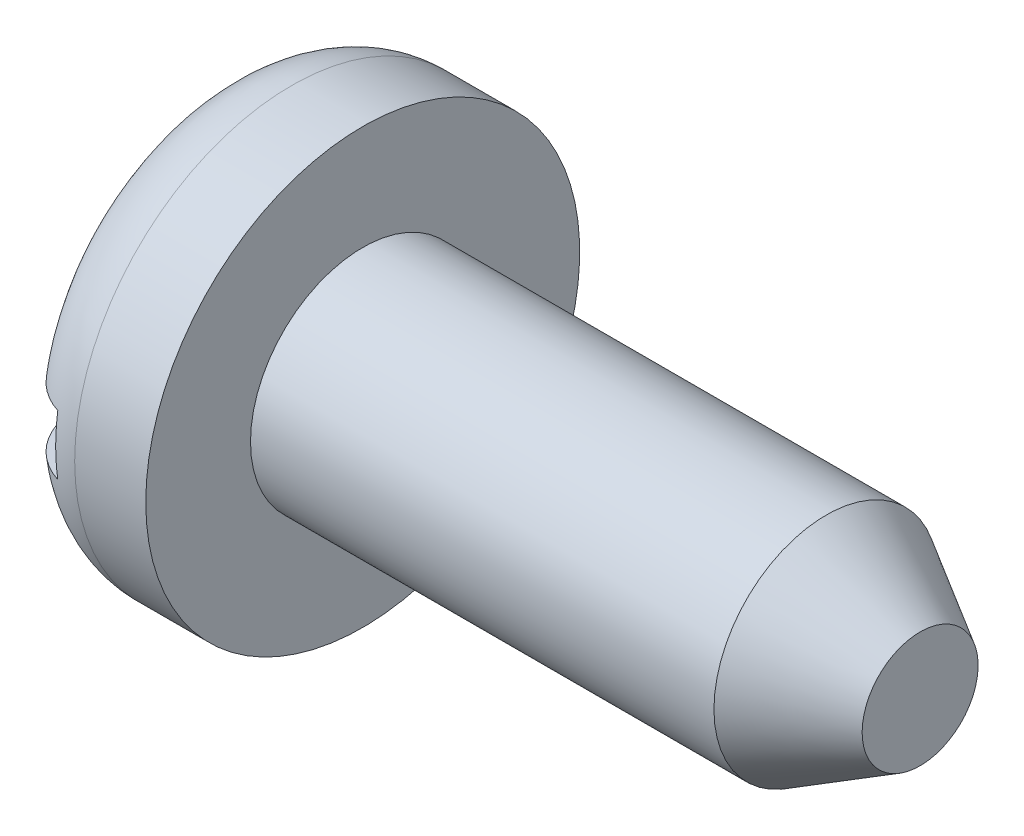
ISO-10303-21;
HEADER;
FILE_DESCRIPTION(('STEP AP214'),'2;1');
FILE_NAME('part.step','',(''),(''),'','','');
FILE_SCHEMA(('AUTOMOTIVE_DESIGN { 1 0 10303 214 1 1 1 1 }'));
ENDSEC;
DATA;
#1=APPLICATION_CONTEXT('core data for automotive mechanical design processes');
#2=APPLICATION_PROTOCOL_DEFINITION('international standard','automotive_design',2000,#1);
#3=PRODUCT_CONTEXT('',#1,'mechanical');
#4=PRODUCT('Part','Part','',(#3));
#5=PRODUCT_RELATED_PRODUCT_CATEGORY('part','',(#4));
#6=PRODUCT_DEFINITION_FORMATION('','',#4);
#7=PRODUCT_DEFINITION_CONTEXT('part definition',#1,'design');
#8=PRODUCT_DEFINITION('design','',#6,#7);
#9=PRODUCT_DEFINITION_SHAPE('','',#8);
#10=(LENGTH_UNIT() NAMED_UNIT(*) SI_UNIT(.MILLI.,.METRE.));
#11=(NAMED_UNIT(*) PLANE_ANGLE_UNIT() SI_UNIT($,.RADIAN.));
#12=(NAMED_UNIT(*) SI_UNIT($,.STERADIAN.) SOLID_ANGLE_UNIT());
#13=UNCERTAINTY_MEASURE_WITH_UNIT(LENGTH_MEASURE(1.E-05),#10,'distance_accuracy_value','');
#14=(GEOMETRIC_REPRESENTATION_CONTEXT(3) GLOBAL_UNCERTAINTY_ASSIGNED_CONTEXT((#13)) GLOBAL_UNIT_ASSIGNED_CONTEXT((#10,
#11,#12)) REPRESENTATION_CONTEXT('',''));
#15=CARTESIAN_POINT('',(0.,0.,0.));
#16=DIRECTION('',(0.,0.,1.));
#17=DIRECTION('',(1.,0.,0.));
#18=AXIS2_PLACEMENT_3D('',#15,#16,#17);
#19=CARTESIAN_POINT('',(0.,0.,0.));
#20=DIRECTION('',(-1.,0.,0.));
#21=DIRECTION('',(0.,0.,1.));
#22=AXIS2_PLACEMENT_3D('',#19,#20,#21);
#23=CYLINDRICAL_SURFACE('',#22,0.762);
#24=CARTESIAN_POINT('',(0.9906,0.,0.));
#25=DIRECTION('',(-1.,0.,0.));
#26=DIRECTION('',(0.,0.,1.));
#27=AXIS2_PLACEMENT_3D('',#24,#25,#26);
#28=CIRCLE('',#27,0.762);
#29=CARTESIAN_POINT('',(0.9906,0.,0.762));
#30=VERTEX_POINT('',#29);
#31=EDGE_CURVE('E158',#30,#30,#28,.T.);
#32=ORIENTED_EDGE('',*,*,#31,.F.);
#33=EDGE_LOOP('',(#32));
#34=FACE_BOUND('',#33,.T.);
#35=CARTESIAN_POINT('',(4.13728568757237,0.,0.));
#36=DIRECTION('',(-1.,0.,0.));
#37=DIRECTION('',(0.,0.,1.));
#38=AXIS2_PLACEMENT_3D('',#35,#36,#37);
#39=CIRCLE('',#38,0.762);
#40=CARTESIAN_POINT('',(4.13728568757237,0.,0.762));
#41=VERTEX_POINT('',#40);
#42=EDGE_CURVE('E267',#41,#41,#39,.T.);
#43=ORIENTED_EDGE('',*,*,#42,.T.);
#44=EDGE_LOOP('',(#43));
#45=FACE_BOUND('',#44,.T.);
#46=ADVANCED_FACE('F68',(#34,#45),#23,.T.);
#47=CARTESIAN_POINT('',(0.,0.,0.));
#48=DIRECTION('',(1.,0.,0.));
#49=DIRECTION('',(0.,0.,-1.));
#50=AXIS2_PLACEMENT_3D('',#47,#48,#49);
#51=PLANE('',#50);
#52=CARTESIAN_POINT('',(0.,0.,0.));
#53=DIRECTION('',(-1.,0.,0.));
#54=DIRECTION('',(0.,0.,1.));
#55=AXIS2_PLACEMENT_3D('',#52,#53,#54);
#56=CIRCLE('',#55,0.965199999999997);
#57=CARTESIAN_POINT('',(0.,0.2032,0.943568121546562));
#58=VERTEX_POINT('',#57);
#59=CARTESIAN_POINT('',(0.,0.2032,-0.943568121547147));
#60=VERTEX_POINT('',#59);
#61=EDGE_CURVE('E152',#58,#60,#56,.T.);
#62=ORIENTED_EDGE('',*,*,#61,.T.);
#63=DIRECTION('',(0.,0.,1.));
#64=VECTOR('',#63,1.);
#65=CARTESIAN_POINT('',(0.,0.2032,-1.4732));
#66=LINE('',#65,#64);
#67=EDGE_CURVE('E156',#60,#58,#66,.T.);
#68=ORIENTED_EDGE('',*,*,#67,.T.);
#69=EDGE_LOOP('',(#62,#68));
#70=FACE_BOUND('',#69,.T.);
#71=ADVANCED_FACE('F174',(#70),#51,.F.);
#72=CARTESIAN_POINT('',(0.,-0.2032,-0.943568121562039));
#73=VERTEX_POINT('',#72);
#74=CARTESIAN_POINT('',(0.,-0.2032,0.943568121547137));
#75=VERTEX_POINT('',#74);
#76=EDGE_CURVE('E131',#73,#75,#56,.T.);
#77=ORIENTED_EDGE('',*,*,#76,.T.);
#78=DIRECTION('',(0.,0.,1.));
#79=VECTOR('',#78,1.);
#80=CARTESIAN_POINT('',(0.,-0.2032,-1.4732));
#81=LINE('',#80,#79);
#82=EDGE_CURVE('E86',#73,#75,#81,.T.);
#83=ORIENTED_EDGE('',*,*,#82,.F.);
#84=EDGE_LOOP('',(#77,#83));
#85=FACE_BOUND('',#84,.T.);
#86=ADVANCED_FACE('F70',(#85),#51,.F.);
#87=CARTESIAN_POINT('',(0.508,0.,0.));
#88=DIRECTION('',(-1.,0.,0.));
#89=DIRECTION('',(0.,0.,1.));
#90=AXIS2_PLACEMENT_3D('',#87,#88,#89);
#91=TOROIDAL_SURFACE('',#90,0.9652,0.508);
#92=CARTESIAN_POINT('',(0.3556,0.,0.));
#93=DIRECTION('',(1.,0.,0.));
#94=DIRECTION('',(0.,0.,-1.));
#95=AXIS2_PLACEMENT_3D('',#92,#93,#94);
#96=CIRCLE('',#95,1.44980111431981);
#97=CARTESIAN_POINT('',(0.3556,-0.2032,-1.43549051932883));
#98=VERTEX_POINT('',#97);
#99=CARTESIAN_POINT('',(0.3556,0.2032,-1.43549051932883));
#100=VERTEX_POINT('',#99);
#101=EDGE_CURVE('E79',#98,#100,#96,.T.);
#102=ORIENTED_EDGE('',*,*,#101,.T.);
#103=CARTESIAN_POINT('',(0.215329781023816,0.2032,-1.36538301604439));
#104=CARTESIAN_POINT('',(0.191944983256552,0.2032,-1.34871688538471));
#105=CARTESIAN_POINT('',(0.169960976103504,0.2032,-1.33004517340369));
#106=CARTESIAN_POINT('',(0.129435108720529,0.2032,-1.28924702351786));
#107=CARTESIAN_POINT('',(0.110897971057547,0.2032,-1.26711592115187));
#108=CARTESIAN_POINT('',(0.0778104746302251,0.2032,-1.22008418730413));
#109=CARTESIAN_POINT('',(0.0632559800643974,0.2032,-1.19518646691671));
#110=CARTESIAN_POINT('',(0.0384902434353467,0.2032,-1.14332891973057));
#111=CARTESIAN_POINT('',(0.0282778660080875,0.2032,-1.11636963416183));
#112=CARTESIAN_POINT('',(0.0123455852323958,0.2032,-1.06084918044724));
#113=CARTESIAN_POINT('',(0.00667399543653688,0.2032,-1.03227416112994));
#114=CARTESIAN_POINT('',(0.000107317688346896,0.2032,-0.974580691497605));
#115=CARTESIAN_POINT('',(-0.000787139628520222,0.2032,-0.945462169943261));
#116=CARTESIAN_POINT('',(0.00219793428343748,0.2032,-0.886884383126212));
#117=CARTESIAN_POINT('',(0.00617386350756716,0.2032,-0.857430046804635));
#118=CARTESIAN_POINT('',(0.0188922095928852,0.2032,-0.799570485455021));
#119=CARTESIAN_POINT('',(0.027635171565733,0.2032,-0.771165380803658));
#120=CARTESIAN_POINT('',(0.0498738289848896,0.2032,-0.715468093785361));
#121=CARTESIAN_POINT('',(0.063481095366547,0.2032,-0.688220446760224));
#122=CARTESIAN_POINT('',(0.095000354806635,0.2032,-0.636333965316028));
#123=CARTESIAN_POINT('',(0.112913375454603,0.2032,-0.61169575567725));
#124=CARTESIAN_POINT('',(0.152912188620876,0.2032,-0.56532174947494));
#125=CARTESIAN_POINT('',(0.175064463510091,0.2032,-0.543643174015656));
#126=CARTESIAN_POINT('',(0.222778207104463,0.2032,-0.504409781797503));
#127=CARTESIAN_POINT('',(0.248340011315482,0.2032,-0.486855371336383));
#128=CARTESIAN_POINT('',(0.301530089174878,0.2032,-0.457008273910215));
#129=CARTESIAN_POINT('',(0.329089146032147,0.2032,-0.444592957026038));
#130=CARTESIAN_POINT('',(0.386028984100668,0.2032,-0.425113677820577));
#131=CARTESIAN_POINT('',(0.415407624704707,0.2032,-0.418043551949753));
#132=CARTESIAN_POINT('',(0.472201440289541,0.2032,-0.41016003303868));
#133=CARTESIAN_POINT('',(0.499544523136924,0.2032,-0.408825069877718));
#134=CARTESIAN_POINT('',(0.554024274863372,0.2032,-0.411075893852427));
#135=CARTESIAN_POINT('',(0.581160976992131,0.2032,-0.41466087070081));
#136=CARTESIAN_POINT('',(0.632878799636407,0.2032,-0.426162382545665));
#137=CARTESIAN_POINT('',(0.657517767441619,0.2032,-0.433823526645508));
#138=CARTESIAN_POINT('',(0.70529059677053,0.2032,-0.452906536237889));
#139=CARTESIAN_POINT('',(0.728423980012061,0.2032,-0.464329589867681));
#140=CARTESIAN_POINT('',(0.774242601599961,0.2032,-0.491392156820385));
#141=CARTESIAN_POINT('',(0.796788648105484,0.2032,-0.507266858440053));
#142=CARTESIAN_POINT('',(0.839182680703283,0.2032,-0.54228103413312));
#143=CARTESIAN_POINT('',(0.859029767712484,0.2032,-0.561421591371043));
#144=CARTESIAN_POINT('',(0.897266847990072,0.2032,-0.604308205893024));
#145=CARTESIAN_POINT('',(0.915367308448543,0.2032,-0.628313168377821));
#146=CARTESIAN_POINT('',(0.947426016921696,0.2032,-0.678948835654952));
#147=CARTESIAN_POINT('',(0.961383432464618,0.2032,-0.705580066719417));
#148=CARTESIAN_POINT('',(0.98511078522371,0.2032,-0.761607938309915));
#149=CARTESIAN_POINT('',(0.994741238623541,0.2032,-0.791063872562686));
#150=CARTESIAN_POINT('',(1.00884220772929,0.2032,-0.851187933607647));
#151=CARTESIAN_POINT('',(1.01331295274497,0.2032,-0.881856006466845));
#152=CARTESIAN_POINT('',(1.01686801593526,0.2032,-0.943068837569881));
#153=CARTESIAN_POINT('',(1.01602778814561,0.2032,-0.973609181679535));
#154=CARTESIAN_POINT('',(1.00909458546175,0.2032,-1.03408891386127));
#155=CARTESIAN_POINT('',(1.00300227947049,0.2032,-1.06402837796438));
#156=CARTESIAN_POINT('',(0.985908571631898,0.2032,-1.12165762872575));
#157=CARTESIAN_POINT('',(0.97503362174308,0.2032,-1.14938493314587));
#158=CARTESIAN_POINT('',(0.948685861116407,0.2032,-1.20256218996186));
#159=CARTESIAN_POINT('',(0.933213586811747,0.2032,-1.22801240760628));
#160=CARTESIAN_POINT('',(0.89846723181936,0.2032,-1.27535454080846));
#161=CARTESIAN_POINT('',(0.879279077836541,0.2032,-1.29730954549528));
#162=CARTESIAN_POINT('',(0.837441643381917,0.2032,-1.3376286301575));
#163=CARTESIAN_POINT('',(0.814792643127839,0.2032,-1.35599300058512));
#164=CARTESIAN_POINT('',(0.767025978772371,0.2032,-1.38834234645129));
#165=CARTESIAN_POINT('',(0.741947758587901,0.2032,-1.40238558541945));
#166=CARTESIAN_POINT('',(0.689776102168764,0.2032,-1.42602105185323));
#167=CARTESIAN_POINT('',(0.662682854759224,0.2032,-1.43561369576909));
#168=CARTESIAN_POINT('',(0.607495786820999,0.2032,-1.45000048844254));
#169=CARTESIAN_POINT('',(0.579412325194333,0.2032,-1.45483440265148));
#170=CARTESIAN_POINT('',(0.522824376888471,0.2032,-1.4597015516763));
#171=CARTESIAN_POINT('',(0.494319790725371,0.2032,-1.45973363339659));
#172=CARTESIAN_POINT('',(0.437799890024802,0.2032,-1.45500220755093));
#173=CARTESIAN_POINT('',(0.409783377574426,0.2032,-1.45025288589255));
#174=CARTESIAN_POINT('',(0.354970748329165,0.2032,-1.4361218473685));
#175=CARTESIAN_POINT('',(0.328173106838488,0.2032,-1.42674610209147));
#176=CARTESIAN_POINT('',(0.287078819494603,0.2032,-1.40837034141523));
#177=CARTESIAN_POINT('',(0.272138306490352,0.2032,-1.40077440713547));
#178=CARTESIAN_POINT('',(0.24308296993529,0.2032,-1.38414070953568));
#179=CARTESIAN_POINT('',(0.228968143293964,0.2032,-1.37510295161281));
#180=CARTESIAN_POINT('',(0.215329781023816,0.2032,-1.36538301604439));
#181=B_SPLINE_CURVE_WITH_KNOTS('',3,(#103,#104,#105,#106,#107,#108,#109,#110,#111,#112,#113,
#114,#115,#116,#117,#118,#119,#120,#121,#122,#123,#124,#125,#126,#127,#128,#129,#130,#131,#132,
#133,#134,#135,#136,#137,#138,#139,#140,#141,#142,#143,#144,#145,#146,#147,#148,#149,#150,#151,
#152,#153,#154,#155,#156,#157,#158,#159,#160,#161,#162,#163,#164,#165,#166,#167,#168,#169,#170,
#171,#172,#173,#174,#175,#176,#177,#178,#179,#180),.UNSPECIFIED.,.T.,.F.,(4,2,2,2,2,2,2,2,2,2,2,
2,2,2,2,2,2,2,2,2,2,2,2,2,2,2,2,2,2,2,2,2,2,2,2,2,2,2,4),(0.,0.0860858664197994,
0.172288824011097,0.258401920897595,0.344492487316557,0.431487309397069,0.518493615493238,
0.607250185600888,0.696016907178807,0.786966152111568,0.877937124119505,0.970473054750091,
1.0630180978651,1.15320598197585,1.24328971098599,1.3249802732473,1.40665738313295,
1.48373329633542,1.56083357608073,1.64321408029617,1.72562196040306,1.81540769437433,
1.90521145701111,1.99773250963021,2.09024945023436,2.18145496769302,2.27264887096263,
2.36156438070333,2.45046951951772,2.53752232781106,2.62456809134573,2.71038278763392,
2.79618945246545,2.88127284414335,2.96637666742217,3.05122873877004,3.13597157208161,
3.18617831917688,3.23638487833799),.UNSPECIFIED.);
#182=EDGE_CURVE('E42',#100,#60,#181,.T.);
#183=ORIENTED_EDGE('',*,*,#182,.T.);
#184=ORIENTED_EDGE('',*,*,#61,.F.);
#185=CARTESIAN_POINT('',(0.329869522395055,0.2032,0.445281621598736));
#186=CARTESIAN_POINT('',(0.301388127727567,0.2032,0.457004986077337));
#187=CARTESIAN_POINT('',(0.273974546779743,0.2032,0.471423119659136));
#188=CARTESIAN_POINT('',(0.22208540367213,0.2032,0.504890847364411));
#189=CARTESIAN_POINT('',(0.197617795729669,0.2032,0.523952578082407));
#190=CARTESIAN_POINT('',(0.153596858359432,0.2032,0.564745375334223));
#191=CARTESIAN_POINT('',(0.133841470806211,0.2032,0.586259042938739));
#192=CARTESIAN_POINT('',(0.0979993542396418,0.2032,0.632122682831279));
#193=CARTESIAN_POINT('',(0.0819099449489213,0.2032,0.656470563158186));
#194=CARTESIAN_POINT('',(0.0529638986825167,0.2032,0.708889100740837));
#195=CARTESIAN_POINT('',(0.0403491262178022,0.2032,0.737093814829098));
#196=CARTESIAN_POINT('',(0.0200538005795712,0.2032,0.795235287370737));
#197=CARTESIAN_POINT('',(0.0123744172169766,0.2032,0.825172454627384));
#198=CARTESIAN_POINT('',(0.00226364021682771,0.2032,0.885780221619265));
#199=CARTESIAN_POINT('',(-0.00019208357882027,0.2032,0.916446745378072));
#200=CARTESIAN_POINT('',(0.000215499636248874,0.2032,0.977744949006937));
#201=CARTESIAN_POINT('',(0.00307803488829328,0.2032,1.00837663328728));
#202=CARTESIAN_POINT('',(0.0139659486859273,0.2032,1.06794438752535));
#203=CARTESIAN_POINT('',(0.0218650304823141,0.2032,1.09690353921922));
#204=CARTESIAN_POINT('',(0.0425262368132979,0.2032,1.15303253778322));
#205=CARTESIAN_POINT('',(0.0552877435612657,0.2032,1.18020261144732));
#206=CARTESIAN_POINT('',(0.084988601790195,0.2032,1.23132857253371));
#207=CARTESIAN_POINT('',(0.101826393931794,0.2032,1.25534348243389));
#208=CARTESIAN_POINT('',(0.139356343475907,0.2032,1.30014514598456));
#209=CARTESIAN_POINT('',(0.160048146491578,0.2032,1.32093219612359));
#210=CARTESIAN_POINT('',(0.204331568152334,0.2032,1.35833837902795));
#211=CARTESIAN_POINT('',(0.227870778380537,0.2032,1.37501957772596));
#212=CARTESIAN_POINT('',(0.277438317149333,0.2032,1.4041461886003));
#213=CARTESIAN_POINT('',(0.303466492316324,0.2032,1.41659186156064));
#214=CARTESIAN_POINT('',(0.356990995047148,0.2032,1.43677120300235));
#215=CARTESIAN_POINT('',(0.384470015728362,0.2032,1.44455079753911));
#216=CARTESIAN_POINT('',(0.440346707045098,0.2032,1.45536093850396));
#217=CARTESIAN_POINT('',(0.468744347416753,0.2032,1.4583916412217));
#218=CARTESIAN_POINT('',(0.52550374831587,0.2032,1.45961107131118));
#219=CARTESIAN_POINT('',(0.553865004421325,0.2032,1.45782341992553));
#220=CARTESIAN_POINT('',(0.609883819147741,0.2032,1.44950941198501));
#221=CARTESIAN_POINT('',(0.637541385690404,0.2032,1.4429831087994));
#222=CARTESIAN_POINT('',(0.691357493366147,0.2032,1.42538788074117));
#223=CARTESIAN_POINT('',(0.717516691820668,0.2032,1.41432096546201));
#224=CARTESIAN_POINT('',(0.767615418543723,0.2032,1.38796878326541));
#225=CARTESIAN_POINT('',(0.79155492684436,0.2032,1.3726834784051));
#226=CARTESIAN_POINT('',(0.836640025706202,0.2032,1.33827130309483));
#227=CARTESIAN_POINT('',(0.857774337524385,0.2032,1.3191296601217));
#228=CARTESIAN_POINT('',(0.896562320947285,0.2032,1.277597196705));
#229=CARTESIAN_POINT('',(0.914215887276242,0.2032,1.25520627802207));
#230=CARTESIAN_POINT('',(0.945713471397315,0.2032,1.20760814494182));
#231=CARTESIAN_POINT('',(0.959523023498841,0.2032,1.1823781315459));
#232=CARTESIAN_POINT('',(0.982777077796622,0.2032,1.12998246814469));
#233=CARTESIAN_POINT('',(0.99222134397096,0.2032,1.10281671356954));
#234=CARTESIAN_POINT('',(1.00663194773297,0.2032,1.04690763023515));
#235=CARTESIAN_POINT('',(1.0115321497481,0.2032,1.01814726867179));
#236=CARTESIAN_POINT('',(1.01653829298727,0.2032,0.960213775553606));
#237=CARTESIAN_POINT('',(1.0166437849315,0.2032,0.931040605573512));
#238=CARTESIAN_POINT('',(1.0120686063743,0.2032,0.872467788856669));
#239=CARTESIAN_POINT('',(1.00728924754504,0.2032,0.84307586652726));
#240=CARTESIAN_POINT('',(0.992985683796285,0.2032,0.785471434229729));
#241=CARTESIAN_POINT('',(0.98346091997659,0.2032,0.757259063610166));
#242=CARTESIAN_POINT('',(0.95967909954554,0.2032,0.702076513184541));
#243=CARTESIAN_POINT('',(0.945311192362788,0.2032,0.67515408783268));
#244=CARTESIAN_POINT('',(0.912326806716271,0.2032,0.624042948669372));
#245=CARTESIAN_POINT('',(0.89370918179318,0.2032,0.599854975177044));
#246=CARTESIAN_POINT('',(0.852394840830588,0.2032,0.554555145650083));
#247=CARTESIAN_POINT('',(0.829639553822971,0.2032,0.533496581812988));
#248=CARTESIAN_POINT('',(0.78081955379486,0.2032,0.495627545914252));
#249=CARTESIAN_POINT('',(0.754755018537147,0.2032,0.478816845815188));
#250=CARTESIAN_POINT('',(0.700850214783034,0.2032,0.450647431345639));
#251=CARTESIAN_POINT('',(0.673090873798326,0.2032,0.43913478213141));
#252=CARTESIAN_POINT('',(0.615907562786327,0.2032,0.421501203163709));
#253=CARTESIAN_POINT('',(0.586484993162199,0.2032,0.415375807352146));
#254=CARTESIAN_POINT('',(0.529860327127162,0.2032,0.409286758160104));
#255=CARTESIAN_POINT('',(0.502714546854052,0.2032,0.408790479263192));
#256=CARTESIAN_POINT('',(0.448794382738234,0.2032,0.412621451438393));
#257=CARTESIAN_POINT('',(0.422019484985736,0.2032,0.416941169030422));
#258=CARTESIAN_POINT('',(0.38460048097378,0.2032,0.426332473149217));
#259=CARTESIAN_POINT('',(0.373465559557966,0.2032,0.429570215711043));
#260=CARTESIAN_POINT('',(0.351459877271103,0.2032,0.436838698586312));
#261=CARTESIAN_POINT('',(0.340589069524359,0.2032,0.440869297008964));
#262=CARTESIAN_POINT('',(0.329869522395055,0.2032,0.445281621598736));
#263=B_SPLINE_CURVE_WITH_KNOTS('',3,(#185,#186,#187,#188,#189,#190,#191,#192,#193,#194,#195,
#196,#197,#198,#199,#200,#201,#202,#203,#204,#205,#206,#207,#208,#209,#210,#211,#212,#213,#214,
#215,#216,#217,#218,#219,#220,#221,#222,#223,#224,#225,#226,#227,#228,#229,#230,#231,#232,#233,
#234,#235,#236,#237,#238,#239,#240,#241,#242,#243,#244,#245,#246,#247,#248,#249,#250,#251,#252,
#253,#254,#255,#256,#257,#258,#259,#260,#261,#262),.UNSPECIFIED.,.T.,.F.,(4,2,2,2,2,2,2,2,2,2,2,
2,2,2,2,2,2,2,2,2,2,2,2,2,2,2,2,2,2,2,2,2,2,2,2,2,2,2,4),(0.,0.0923499530914659,
0.184943913343557,0.272196795362268,0.359385678706387,0.451635602316838,0.543907383415096,
0.635748442022124,0.727576174163345,0.817187226434392,0.906786897129309,0.994349898403129,
1.08190485199085,1.16804138965665,1.25417262288117,1.33944156766225,1.42470770611857,
1.50955660162777,1.59440454153769,1.67921496971037,1.76402616074696,1.84916863735994,
1.93431368872725,2.02019922116351,2.10608939670858,2.19321087561959,2.28034051807761,
2.36926591537651,2.45820178853058,2.54932966004309,2.64048214451507,2.7330427549519,
2.82559839541539,2.915262156004,3.0048515146634,3.08588429529546,3.16679049705897,
3.20155447964747,3.23631224646719),.UNSPECIFIED.);
#264=CARTESIAN_POINT('',(0.3556,0.2032,1.43549051932883));
#265=VERTEX_POINT('',#264);
#266=EDGE_CURVE('E94',#58,#265,#263,.T.);
#267=ORIENTED_EDGE('',*,*,#266,.T.);
#268=CARTESIAN_POINT('',(0.3556,-0.2032,1.43549051932884));
#269=VERTEX_POINT('',#268);
#270=EDGE_CURVE('E123',#265,#269,#96,.T.);
#271=ORIENTED_EDGE('',*,*,#270,.T.);
#272=CARTESIAN_POINT('',(0.329869522395055,-0.2032,0.445281621598736));
#273=CARTESIAN_POINT('',(0.358502494176373,-0.2032,0.433499808034866));
#274=CARTESIAN_POINT('',(0.388290304351268,-0.2032,0.424410461475539));
#275=CARTESIAN_POINT('',(0.449099821677676,-0.2032,0.412341247768864));
#276=CARTESIAN_POINT('',(0.480121989867464,-0.2032,0.409363685655782));
#277=CARTESIAN_POINT('',(0.53746599007488,-0.2032,0.409751620192525));
#278=CARTESIAN_POINT('',(0.563796930910565,-0.2032,0.412235095009878));
#279=CARTESIAN_POINT('',(0.615642666509766,-0.2032,0.421635589980615));
#280=CARTESIAN_POINT('',(0.64115766272518,-0.2032,0.42855150677791));
#281=CARTESIAN_POINT('',(0.690499191653886,-0.2032,0.446345559896962));
#282=CARTESIAN_POINT('',(0.714338545173781,-0.2032,0.457188496499537));
#283=CARTESIAN_POINT('',(0.760081472444047,-0.2032,0.482384943199705));
#284=CARTESIAN_POINT('',(0.781984335358085,-0.2032,0.496739735185986));
#285=CARTESIAN_POINT('',(0.825382731327116,-0.2032,0.529991463028514));
#286=CARTESIAN_POINT('',(0.846649407051954,-0.2032,0.549187303358749));
#287=CARTESIAN_POINT('',(0.885922728100186,-0.2032,0.590667044257015));
#288=CARTESIAN_POINT('',(0.903928320836657,-0.2032,0.612951937802812));
#289=CARTESIAN_POINT('',(0.937387227635518,-0.2032,0.661679653441244));
#290=CARTESIAN_POINT('',(0.952577924434256,-0.2032,0.688303442398011));
#291=CARTESIAN_POINT('',(0.978319173281631,-0.2032,0.743709469845553));
#292=CARTESIAN_POINT('',(0.988869332063633,-0.2032,0.772491891029746));
#293=CARTESIAN_POINT('',(1.00504837830833,-0.2032,0.831670290394121));
#294=CARTESIAN_POINT('',(1.01063569309784,-0.2032,0.862077678125007));
#295=CARTESIAN_POINT('',(1.01650465341225,-0.2032,0.923401979136258));
#296=CARTESIAN_POINT('',(1.01678678144941,-0.2032,0.954318845822983));
#297=CARTESIAN_POINT('',(1.01202058328279,-0.2032,1.01507018324685));
#298=CARTESIAN_POINT('',(1.00708687297332,-0.2032,1.04491362757893));
#299=CARTESIAN_POINT('',(0.992152480789314,-0.2032,1.10330552277895));
#300=CARTESIAN_POINT('',(0.982152462170479,-0.2032,1.13185414262594));
#301=CARTESIAN_POINT('',(0.957639794412005,-0.2032,1.18611286206058));
#302=CARTESIAN_POINT('',(0.943242025983073,-0.2032,1.21187488170819));
#303=CARTESIAN_POINT('',(0.910249452515353,-0.2032,1.26055500250789));
#304=CARTESIAN_POINT('',(0.891655088205099,-0.2032,1.28347340190695));
#305=CARTESIAN_POINT('',(0.851169324980318,-0.2032,1.32537967952597));
#306=CARTESIAN_POINT('',(0.829344082985125,-0.2032,1.34443149526756));
#307=CARTESIAN_POINT('',(0.782772620698575,-0.2032,1.37854814536895));
#308=CARTESIAN_POINT('',(0.758026604318453,-0.2032,1.39361325781906));
#309=CARTESIAN_POINT('',(0.706631209617844,-0.2032,1.41915051527878));
#310=CARTESIAN_POINT('',(0.680007551033928,-0.2032,1.42967444318619));
#311=CARTESIAN_POINT('',(0.625364610086949,-0.2032,1.44607110671336));
#312=CARTESIAN_POINT('',(0.597345384499068,-0.2032,1.45194403138363));
#313=CARTESIAN_POINT('',(0.540896588120866,-0.2032,1.4588417045919));
#314=CARTESIAN_POINT('',(0.51247072459902,-0.2032,1.45989682611792));
#315=CARTESIAN_POINT('',(0.455846852978004,-0.2032,1.45721066930007));
#316=CARTESIAN_POINT('',(0.427648840888628,-0.2032,1.45346947513477));
#317=CARTESIAN_POINT('',(0.372330937118058,-0.2032,1.44131185064933));
#318=CARTESIAN_POINT('',(0.34520927195101,-0.2032,1.43290348494));
#319=CARTESIAN_POINT('',(0.29275745140135,-0.2032,1.41166409669944));
#320=CARTESIAN_POINT('',(0.267427302601809,-0.2032,1.39883305791776));
#321=CARTESIAN_POINT('',(0.219202631864452,-0.2032,1.36908393354464));
#322=CARTESIAN_POINT('',(0.196314608695224,-0.2032,1.352155316345));
#323=CARTESIAN_POINT('',(0.153680732218265,-0.2032,1.31472098604245));
#324=CARTESIAN_POINT('',(0.133934948340391,-0.2032,1.29421519392047));
#325=CARTESIAN_POINT('',(0.09798669051985,-0.2032,1.25005655152313));
#326=CARTESIAN_POINT('',(0.0818107677296374,-0.2032,1.22638209375308));
#327=CARTESIAN_POINT('',(0.0536071822730699,-0.2032,1.17668070356613));
#328=CARTESIAN_POINT('',(0.0415797226489106,-0.2032,1.15065365608285));
#329=CARTESIAN_POINT('',(0.0218430165709704,-0.2032,1.0966403273298));
#330=CARTESIAN_POINT('',(0.0141899339824285,-0.2032,1.06863353554462));
#331=CARTESIAN_POINT('',(0.00360096391010489,-0.2032,1.01174340938874));
#332=CARTESIAN_POINT('',(0.00066547628877609,-0.2032,0.982860000927568));
#333=CARTESIAN_POINT('',(-0.000473951285651063,-0.2032,0.924457701330377));
#334=CARTESIAN_POINT('',(0.00141209445592993,-0.2032,0.89493707121417));
#335=CARTESIAN_POINT('',(0.0099926650034881,-0.2032,0.836606568743299));
#336=CARTESIAN_POINT('',(0.0166874029532356,-0.2032,0.807796727952698));
#337=CARTESIAN_POINT('',(0.0348652038111807,-0.2032,0.75096878618129));
#338=CARTESIAN_POINT('',(0.0464589481094805,-0.2032,0.722986095577128));
#339=CARTESIAN_POINT('',(0.0740900608781219,-0.2032,0.669288346876587));
#340=CARTESIAN_POINT('',(0.0901302121932591,-0.2032,0.643574722236632));
#341=CARTESIAN_POINT('',(0.126599193260723,-0.2032,0.594601256482266));
#342=CARTESIAN_POINT('',(0.14711543453727,-0.2032,0.571406510293939));
#343=CARTESIAN_POINT('',(0.19176560949425,-0.2032,0.528864315192744));
#344=CARTESIAN_POINT('',(0.215892689740527,-0.2032,0.509509736041223));
#345=CARTESIAN_POINT('',(0.255421374686726,-0.2032,0.483159682619145));
#346=CARTESIAN_POINT('',(0.269772828851747,-0.2032,0.474557792483459));
#347=CARTESIAN_POINT('',(0.299259982169124,-0.2032,0.458801822274393));
#348=CARTESIAN_POINT('',(0.314396124251208,-0.2032,0.45164857133496));
#349=CARTESIAN_POINT('',(0.329869522395055,-0.2032,0.445281621598736));
#350=B_SPLINE_CURVE_WITH_KNOTS('',3,(#272,#273,#274,#275,#276,#277,#278,#279,#280,#281,#282,
#283,#284,#285,#286,#287,#288,#289,#290,#291,#292,#293,#294,#295,#296,#297,#298,#299,#300,#301,
#302,#303,#304,#305,#306,#307,#308,#309,#310,#311,#312,#313,#314,#315,#316,#317,#318,#319,#320,
#321,#322,#323,#324,#325,#326,#327,#328,#329,#330,#331,#332,#333,#334,#335,#336,#337,#338,#339,
#340,#341,#342,#343,#344,#345,#346,#347,#348,#349),.UNSPECIFIED.,.T.,.F.,(4,2,2,2,2,2,2,2,2,2,2,
2,2,2,2,2,2,2,2,2,2,2,2,2,2,2,2,2,2,2,2,2,2,2,2,2,2,2,4),(0.,0.0928052670822274,0.1856455288614,
0.264601339227798,0.3435375029623,0.421782959828466,0.500057020381445,0.585637384224793,
0.671245321992686,0.762773548554793,0.854309530266337,0.946605248426778,1.03889257215468,
1.12919326228462,1.21948213375434,1.30758929191674,1.39568720132484,1.48218191295935,
1.56867058961124,1.65414515714745,1.73961625019865,1.82454775508255,1.90947776938143,
1.99426148418719,2.07904551052126,2.16404980712716,2.24905598169851,2.3346745493807,
2.4202973069798,2.50699603740345,2.59370211600751,2.68203818078094,2.77037816126431,
2.860830742985,2.9513400640081,3.04380682986178,3.13610026724349,3.18622408000129,
3.23637650072719),.UNSPECIFIED.);
#351=EDGE_CURVE('E125',#269,#75,#350,.T.);
#352=ORIENTED_EDGE('',*,*,#351,.T.);
#353=ORIENTED_EDGE('',*,*,#76,.F.);
#354=CARTESIAN_POINT('',(0.215329781023816,-0.2032,-1.36538301604439));
#355=CARTESIAN_POINT('',(0.238413126897151,-0.2032,-1.38183109446536));
#356=CARTESIAN_POINT('',(0.262895914233662,-0.2032,-1.39635027534062));
#357=CARTESIAN_POINT('',(0.313970554916217,-0.2032,-1.42108757012592));
#358=CARTESIAN_POINT('',(0.340564809978248,-0.2032,-1.4313007003022));
#359=CARTESIAN_POINT('',(0.395087096999238,-0.2032,-1.44710688363505));
#360=CARTESIAN_POINT('',(0.423014730758561,-0.2032,-1.4527013071033));
#361=CARTESIAN_POINT('',(0.479406030152789,-0.2032,-1.45910641899405));
#362=CARTESIAN_POINT('',(0.507869564071341,-0.2032,-1.45991826789409));
#363=CARTESIAN_POINT('',(0.564455785140096,-0.2032,-1.45674197903137));
#364=CARTESIAN_POINT('',(0.592579147480724,-0.2032,-1.45276585962451));
#365=CARTESIAN_POINT('',(0.647760303715466,-0.2032,-1.4401505575351));
#366=CARTESIAN_POINT('',(0.674818066024727,-0.2032,-1.43151123674466));
#367=CARTESIAN_POINT('',(0.727117700604603,-0.2032,-1.40981738425861));
#368=CARTESIAN_POINT('',(0.752358606254821,-0.2032,-1.39676052305413));
#369=CARTESIAN_POINT('',(0.800303930631048,-0.2032,-1.3666142754055));
#370=CARTESIAN_POINT('',(0.823008318850341,-0.2032,-1.34952484046925));
#371=CARTESIAN_POINT('',(0.86536223908236,-0.2032,-1.31171460186089));
#372=CARTESIAN_POINT('',(0.88499609587991,-0.2032,-1.29097624443156));
#373=CARTESIAN_POINT('',(0.920543329252123,-0.2032,-1.2465257941014));
#374=CARTESIAN_POINT('',(0.93645658025623,-0.2032,-1.22281360087501));
#375=CARTESIAN_POINT('',(0.964288194645583,-0.2032,-1.17284246110559));
#376=CARTESIAN_POINT('',(0.976165416695147,-0.2032,-1.14656061017566));
#377=CARTESIAN_POINT('',(0.995414326754773,-0.2032,-1.09239735418125));
#378=CARTESIAN_POINT('',(1.00278573711904,-0.2032,-1.06451585066277));
#379=CARTESIAN_POINT('',(1.01294858712236,-0.2032,-1.00747782645689));
#380=CARTESIAN_POINT('',(1.01566604721406,-0.2032,-0.978308139249606));
#381=CARTESIAN_POINT('',(1.01627607582494,-0.2032,-0.919919760840352));
#382=CARTESIAN_POINT('',(1.01416814043723,-0.2032,-0.890701064838882));
#383=CARTESIAN_POINT('',(1.00514471186073,-0.2032,-0.832359355561397));
#384=CARTESIAN_POINT('',(0.998124710666667,-0.2032,-0.803252519495484));
#385=CARTESIAN_POINT('',(0.979416305771098,-0.2032,-0.746580797024275));
#386=CARTESIAN_POINT('',(0.967727325107909,-0.2032,-0.719016101666671));
#387=CARTESIAN_POINT('',(0.939693800496279,-0.2032,-0.665502714307369));
#388=CARTESIAN_POINT('',(0.923242711047486,-0.2032,-0.639609797693235));
#389=CARTESIAN_POINT('',(0.886263981179655,-0.2032,-0.590906169275268));
#390=CARTESIAN_POINT('',(0.865735043835754,-0.2032,-0.56809644194203));
#391=CARTESIAN_POINT('',(0.820921769674387,-0.2032,-0.526066680198553));
#392=CARTESIAN_POINT('',(0.796605271256423,-0.2032,-0.506880831154938));
#393=CARTESIAN_POINT('',(0.744964173580092,-0.2032,-0.473090999434226));
#394=CARTESIAN_POINT('',(0.717640491583775,-0.2032,-0.458485624808041));
#395=CARTESIAN_POINT('',(0.662102137714638,-0.2032,-0.435191633007922));
#396=CARTESIAN_POINT('',(0.633993124033119,-0.2032,-0.426252743324374));
#397=CARTESIAN_POINT('',(0.57660622833749,-0.2032,-0.413819093573879));
#398=CARTESIAN_POINT('',(0.547329662333877,-0.2032,-0.410318372339115));
#399=CARTESIAN_POINT('',(0.49156776101351,-0.2032,-0.409090574353062));
#400=CARTESIAN_POINT('',(0.465092981310181,-0.2032,-0.410826305573427));
#401=CARTESIAN_POINT('',(0.412832905957694,-0.2032,-0.418808086327343));
#402=CARTESIAN_POINT('',(0.38704772989086,-0.2032,-0.425054912925956));
#403=CARTESIAN_POINT('',(0.337286264790685,-0.2032,-0.44154946944534));
#404=CARTESIAN_POINT('',(0.313286874926257,-0.2032,-0.451728269601996));
#405=CARTESIAN_POINT('',(0.267133442746061,-0.2032,-0.475639408030986));
#406=CARTESIAN_POINT('',(0.244979941788716,-0.2032,-0.489372783966552));
#407=CARTESIAN_POINT('',(0.201037216386801,-0.2032,-0.521321265624008));
#408=CARTESIAN_POINT('',(0.179460369212751,-0.2032,-0.539828555474386));
#409=CARTESIAN_POINT('',(0.139446331758672,-0.2032,-0.579973733943046));
#410=CARTESIAN_POINT('',(0.121010203030045,-0.2032,-0.601612676495965));
#411=CARTESIAN_POINT('',(0.0864520527852966,-0.2032,-0.649175568214048));
#412=CARTESIAN_POINT('',(0.0706024941736902,-0.2032,-0.675298169346554));
#413=CARTESIAN_POINT('',(0.0434482394372238,-0.2032,-0.729810227873954));
#414=CARTESIAN_POINT('',(0.0321440488301683,-0.2032,-0.758199936986993));
#415=CARTESIAN_POINT('',(0.0143320161910842,-0.2032,-0.816838721300952));
#416=CARTESIAN_POINT('',(0.00788572175143113,-0.2032,-0.847106563481268));
#417=CARTESIAN_POINT('',(0.000281304628429735,-0.2032,-0.908299964235672));
#418=CARTESIAN_POINT('',(-0.000877477034961123,-0.2032,-0.939225440366497));
#419=CARTESIAN_POINT('',(0.00216442279748179,-0.2032,-1.0001769204773));
#420=CARTESIAN_POINT('',(0.00625570125848646,-0.2032,-1.0302083657466));
#421=CARTESIAN_POINT('',(0.0195535730820095,-0.2032,-1.08912663228184));
#422=CARTESIAN_POINT('',(0.0287608382481251,-0.2032,-1.11801330268836));
#423=CARTESIAN_POINT('',(0.0517804431749336,-0.2032,-1.17307269479846));
#424=CARTESIAN_POINT('',(0.0654771160509607,-0.2032,-1.19929387088692));
#425=CARTESIAN_POINT('',(0.0971505659468274,-0.2032,-1.24897777309146));
#426=CARTESIAN_POINT('',(0.115121426356766,-0.2032,-1.27244424596809));
#427=CARTESIAN_POINT('',(0.147055178069885,-0.2032,-1.3074173745662));
#428=CARTESIAN_POINT('',(0.159843359569796,-0.2032,-1.32001628567202));
#429=CARTESIAN_POINT('',(0.18667752171409,-0.2032,-1.34379523104751));
#430=CARTESIAN_POINT('',(0.200723490756802,-0.2032,-1.3549752784023));
#431=CARTESIAN_POINT('',(0.215329781023816,-0.2032,-1.36538301604439));
#432=B_SPLINE_CURVE_WITH_KNOTS('',3,(#354,#355,#356,#357,#358,#359,#360,#361,#362,#363,#364,
#365,#366,#367,#368,#369,#370,#371,#372,#373,#374,#375,#376,#377,#378,#379,#380,#381,#382,#383,
#384,#385,#386,#387,#388,#389,#390,#391,#392,#393,#394,#395,#396,#397,#398,#399,#400,#401,#402,
#403,#404,#405,#406,#407,#408,#409,#410,#411,#412,#413,#414,#415,#416,#417,#418,#419,#420,#421,
#422,#423,#424,#425,#426,#427,#428,#429,#430,#431),.UNSPECIFIED.,.T.,.F.,(4,2,2,2,2,2,2,2,2,2,2,
2,2,2,2,2,2,2,2,2,2,2,2,2,2,2,2,2,2,2,2,2,2,2,2,2,2,2,4),(0.,0.0849667237557992,
0.170031518067171,0.255071065654456,0.340089977797271,0.424895926718179,0.509704387435722,
0.594557640225211,0.679411913435601,0.764686147062325,0.84996325828162,0.93608525178496,
1.02221255154641,1.10969665048098,1.19718988563083,1.28660355498534,1.3760282769112,
1.4676329681473,1.55926684025855,1.6517261168211,1.74415726887496,1.83215338522869,
1.9200529744698,1.99925203045362,2.07846473223715,2.15634757332071,2.23425317590806,
2.31917295006146,2.40412137008595,2.49536039828994,2.58660957093207,2.6789962490535,
2.77137141275543,2.86185252009593,2.95234551173306,3.04066950987481,3.12887194855077,
3.18263625478368,3.2364000651526),.UNSPECIFIED.);
#433=EDGE_CURVE('E121',#73,#98,#432,.T.);
#434=ORIENTED_EDGE('',*,*,#433,.T.);
#435=EDGE_LOOP('',(#102,#183,#184,#267,#271,#352,#353,#434));
#436=FACE_BOUND('',#435,.T.);
#437=CARTESIAN_POINT('',(0.508000000000003,0.,0.));
#438=DIRECTION('',(-1.,0.,0.));
#439=DIRECTION('',(0.,0.,1.));
#440=AXIS2_PLACEMENT_3D('',#437,#438,#439);
#441=CIRCLE('',#440,1.4732);
#442=CARTESIAN_POINT('',(0.508000000000003,0.,1.4732));
#443=VERTEX_POINT('',#442);
#444=EDGE_CURVE('E168',#443,#443,#441,.T.);
#445=ORIENTED_EDGE('',*,*,#444,.T.);
#446=EDGE_LOOP('',(#445));
#447=FACE_BOUND('',#446,.T.);
#448=ADVANCED_FACE('F128',(#436,#447),#91,.T.);
#449=CARTESIAN_POINT('',(0.,0.,0.));
#450=DIRECTION('',(-1.,0.,0.));
#451=DIRECTION('',(0.,0.,1.));
#452=AXIS2_PLACEMENT_3D('',#449,#450,#451);
#453=CYLINDRICAL_SURFACE('',#452,1.4732);
#454=ORIENTED_EDGE('',*,*,#444,.F.);
#455=EDGE_LOOP('',(#454));
#456=FACE_BOUND('',#455,.T.);
#457=CARTESIAN_POINT('',(0.9906,0.,0.));
#458=DIRECTION('',(-1.,0.,0.));
#459=DIRECTION('',(0.,0.,1.));
#460=AXIS2_PLACEMENT_3D('',#457,#458,#459);
#461=CIRCLE('',#460,1.4732);
#462=CARTESIAN_POINT('',(0.9906,0.,1.4732));
#463=VERTEX_POINT('',#462);
#464=EDGE_CURVE('E166',#463,#463,#461,.T.);
#465=ORIENTED_EDGE('',*,*,#464,.T.);
#466=EDGE_LOOP('',(#465));
#467=FACE_BOUND('',#466,.T.);
#468=ADVANCED_FACE('F188',(#456,#467),#453,.T.);
#469=CARTESIAN_POINT('',(0.9906,0.762,0.));
#470=DIRECTION('',(-1.,0.,0.));
#471=DIRECTION('',(0.,0.,1.));
#472=AXIS2_PLACEMENT_3D('',#469,#470,#471);
#473=PLANE('',#472);
#474=ORIENTED_EDGE('',*,*,#464,.F.);
#475=EDGE_LOOP('',(#474));
#476=FACE_BOUND('',#475,.T.);
#477=ORIENTED_EDGE('',*,*,#31,.T.);
#478=EDGE_LOOP('',(#477));
#479=FACE_BOUND('',#478,.T.);
#480=ADVANCED_FACE('F186',(#476,#479),#473,.F.);
#481=CARTESIAN_POINT('',(0.,0.2032,-1.4732));
#482=DIRECTION('',(0.,1.,0.));
#483=DIRECTION('',(0.,0.,1.));
#484=AXIS2_PLACEMENT_3D('',#481,#482,#483);
#485=PLANE('',#484);
#486=DIRECTION('',(0.,0.,1.));
#487=VECTOR('',#486,1.);
#488=CARTESIAN_POINT('',(0.3556,0.2032,-1.4732));
#489=LINE('',#488,#487);
#490=EDGE_CURVE('E118',#100,#265,#489,.T.);
#491=ORIENTED_EDGE('',*,*,#490,.T.);
#492=ORIENTED_EDGE('',*,*,#266,.F.);
#493=ORIENTED_EDGE('',*,*,#67,.F.);
#494=ORIENTED_EDGE('',*,*,#182,.F.);
#495=EDGE_LOOP('',(#491,#492,#493,#494));
#496=FACE_BOUND('',#495,.T.);
#497=ADVANCED_FACE('F155',(#496),#485,.F.);
#498=CARTESIAN_POINT('',(0.3556,0.2032,-1.4732));
#499=DIRECTION('',(1.,0.,0.));
#500=DIRECTION('',(0.,0.,-1.));
#501=AXIS2_PLACEMENT_3D('',#498,#499,#500);
#502=PLANE('',#501);
#503=ORIENTED_EDGE('',*,*,#490,.F.);
#504=ORIENTED_EDGE('',*,*,#101,.F.);
#505=DIRECTION('',(0.,0.,1.));
#506=VECTOR('',#505,1.);
#507=CARTESIAN_POINT('',(0.3556,-0.2032,-1.4732));
#508=LINE('',#507,#506);
#509=EDGE_CURVE('E116',#98,#269,#508,.T.);
#510=ORIENTED_EDGE('',*,*,#509,.T.);
#511=ORIENTED_EDGE('',*,*,#270,.F.);
#512=EDGE_LOOP('',(#503,#504,#510,#511));
#513=FACE_BOUND('',#512,.T.);
#514=ADVANCED_FACE('F115',(#513),#502,.F.);
#515=CARTESIAN_POINT('',(0.,-0.2032,-1.4732));
#516=DIRECTION('',(0.,-1.,0.));
#517=DIRECTION('',(0.,0.,-1.));
#518=AXIS2_PLACEMENT_3D('',#515,#516,#517);
#519=PLANE('',#518);
#520=ORIENTED_EDGE('',*,*,#82,.T.);
#521=ORIENTED_EDGE('',*,*,#351,.F.);
#522=ORIENTED_EDGE('',*,*,#509,.F.);
#523=ORIENTED_EDGE('',*,*,#433,.F.);
#524=EDGE_LOOP('',(#520,#521,#522,#523));
#525=FACE_BOUND('',#524,.T.);
#526=ADVANCED_FACE('F124',(#525),#519,.F.);
#527=CARTESIAN_POINT('',(4.13728568757237,0.,0.));
#528=DIRECTION('',(-1.,0.,0.));
#529=DIRECTION('',(0.,0.,1.));
#530=AXIS2_PLACEMENT_3D('',#527,#528,#529);
#531=CONICAL_SURFACE('',#530,0.762,0.523598775598293);
#532=CARTESIAN_POINT('',(4.7752,0.,0.));
#533=DIRECTION('',(-1.,0.,0.));
#534=DIRECTION('',(0.,0.,1.));
#535=AXIS2_PLACEMENT_3D('',#532,#533,#534);
#536=CIRCLE('',#535,0.3937);
#537=CARTESIAN_POINT('',(4.7752,0.,0.3937));
#538=VERTEX_POINT('',#537);
#539=EDGE_CURVE('E163',#538,#538,#536,.T.);
#540=ORIENTED_EDGE('',*,*,#539,.T.);
#541=EDGE_LOOP('',(#540));
#542=FACE_BOUND('',#541,.T.);
#543=ORIENTED_EDGE('',*,*,#42,.F.);
#544=EDGE_LOOP('',(#543));
#545=FACE_BOUND('',#544,.T.);
#546=ADVANCED_FACE('F144',(#542,#545),#531,.T.);
#547=CARTESIAN_POINT('',(4.7752,0.762,0.));
#548=DIRECTION('',(-1.,0.,0.));
#549=DIRECTION('',(0.,0.,1.));
#550=AXIS2_PLACEMENT_3D('',#547,#548,#549);
#551=PLANE('',#550);
#552=ORIENTED_EDGE('',*,*,#539,.F.);
#553=EDGE_LOOP('',(#552));
#554=FACE_BOUND('',#553,.T.);
#555=ADVANCED_FACE('F145',(#554),#551,.F.);
#556=CLOSED_SHELL('',(#46,#71,#86,#448,#468,#480,#497,#514,#526,#546,#555));
#557=MANIFOLD_SOLID_BREP('B6',#556);
#558=ADVANCED_BREP_SHAPE_REPRESENTATION('',(#18,#557),#14);
#559=SHAPE_DEFINITION_REPRESENTATION(#9,#558);
ENDSEC;
END-ISO-10303-21;
